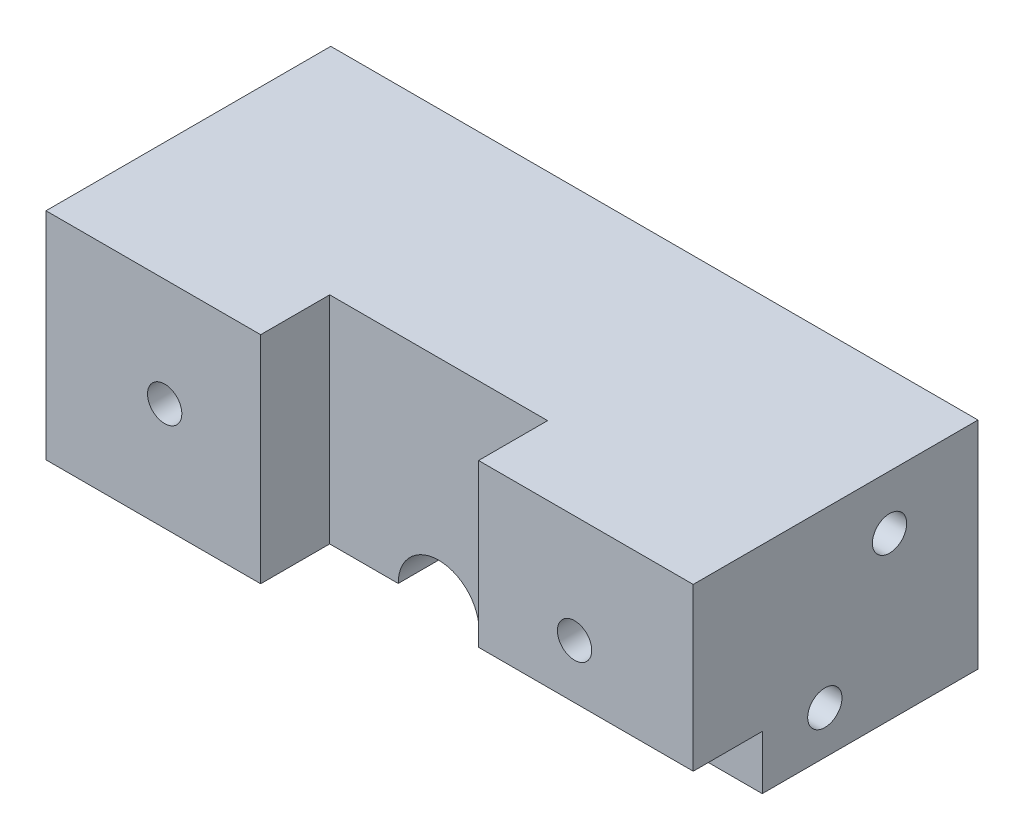
ISO-10303-21;
HEADER;
FILE_DESCRIPTION(('STEP AP214'),'2;1');
FILE_NAME('part.step','',(''),(''),'','','');
FILE_SCHEMA(('AUTOMOTIVE_DESIGN { 1 0 10303 214 1 1 1 1 }'));
ENDSEC;
DATA;
#1=APPLICATION_CONTEXT('core data for automotive mechanical design processes');
#2=APPLICATION_PROTOCOL_DEFINITION('international standard','automotive_design',2000,#1);
#3=PRODUCT_CONTEXT('',#1,'mechanical');
#4=PRODUCT('Part','Part','',(#3));
#5=PRODUCT_RELATED_PRODUCT_CATEGORY('part','',(#4));
#6=PRODUCT_DEFINITION_FORMATION('','',#4);
#7=PRODUCT_DEFINITION_CONTEXT('part definition',#1,'design');
#8=PRODUCT_DEFINITION('design','',#6,#7);
#9=PRODUCT_DEFINITION_SHAPE('','',#8);
#10=(LENGTH_UNIT() NAMED_UNIT(*) SI_UNIT(.MILLI.,.METRE.));
#11=(NAMED_UNIT(*) PLANE_ANGLE_UNIT() SI_UNIT($,.RADIAN.));
#12=(NAMED_UNIT(*) SI_UNIT($,.STERADIAN.) SOLID_ANGLE_UNIT());
#13=UNCERTAINTY_MEASURE_WITH_UNIT(LENGTH_MEASURE(1.E-05),#10,'distance_accuracy_value','');
#14=(GEOMETRIC_REPRESENTATION_CONTEXT(3) GLOBAL_UNCERTAINTY_ASSIGNED_CONTEXT((#13)) GLOBAL_UNIT_ASSIGNED_CONTEXT((#10,
#11,#12)) REPRESENTATION_CONTEXT('',''));
#15=CARTESIAN_POINT('',(0.,0.,0.));
#16=DIRECTION('',(0.,0.,1.));
#17=DIRECTION('',(1.,0.,0.));
#18=AXIS2_PLACEMENT_3D('',#15,#16,#17);
#19=CARTESIAN_POINT('',(0.,0.,-39.497));
#20=DIRECTION('',(0.,0.,-1.));
#21=DIRECTION('',(-1.,0.,0.));
#22=AXIS2_PLACEMENT_3D('',#19,#20,#21);
#23=PLANE('',#22);
#24=DIRECTION('',(0.,1.,0.));
#25=VECTOR('',#24,1.);
#26=CARTESIAN_POINT('',(38.1,-12.7,-39.497));
#27=LINE('',#26,#25);
#28=CARTESIAN_POINT('',(38.1,-6.35,-39.497));
#29=VERTEX_POINT('',#28);
#30=CARTESIAN_POINT('',(38.1,12.7,-39.497));
#31=VERTEX_POINT('',#30);
#32=EDGE_CURVE('E262',#29,#31,#27,.T.);
#33=ORIENTED_EDGE('',*,*,#32,.T.);
#34=DIRECTION('',(1.,0.,0.));
#35=VECTOR('',#34,1.);
#36=CARTESIAN_POINT('',(0.,12.7,-39.497));
#37=LINE('',#36,#35);
#38=CARTESIAN_POINT('',(12.827,12.7,-39.497));
#39=VERTEX_POINT('',#38);
#40=EDGE_CURVE('E261',#39,#31,#37,.T.);
#41=ORIENTED_EDGE('',*,*,#40,.F.);
#42=DIRECTION('',(0.,-1.,0.));
#43=VECTOR('',#42,1.);
#44=CARTESIAN_POINT('',(12.827,12.7,-39.497));
#45=LINE('',#44,#43);
#46=CARTESIAN_POINT('',(12.827,-6.35,-39.497));
#47=VERTEX_POINT('',#46);
#48=EDGE_CURVE('E11',#39,#47,#45,.T.);
#49=ORIENTED_EDGE('',*,*,#48,.T.);
#50=DIRECTION('',(-1.,0.,0.));
#51=VECTOR('',#50,1.);
#52=CARTESIAN_POINT('',(12.827,-6.35,-39.497));
#53=LINE('',#52,#51);
#54=EDGE_CURVE('E198',#29,#47,#53,.T.);
#55=ORIENTED_EDGE('',*,*,#54,.F.);
#56=EDGE_LOOP('',(#33,#41,#49,#55));
#57=FACE_BOUND('',#56,.T.);
#58=CARTESIAN_POINT('',(24.13,0.,-39.497));
#59=DIRECTION('',(0.,0.,-1.));
#60=DIRECTION('',(-1.,0.,0.));
#61=AXIS2_PLACEMENT_3D('',#58,#59,#60);
#62=CIRCLE('',#61,2.0193);
#63=CARTESIAN_POINT('',(22.1107,0.,-39.497));
#64=VERTEX_POINT('',#63);
#65=EDGE_CURVE('E267',#64,#64,#62,.F.);
#66=ORIENTED_EDGE('',*,*,#65,.F.);
#67=EDGE_LOOP('',(#66));
#68=FACE_BOUND('',#67,.T.);
#69=ADVANCED_FACE('F36',(#57,#68),#23,.F.);
#70=DIRECTION('',(1.,0.,0.));
#71=VECTOR('',#70,1.);
#72=CARTESIAN_POINT('',(0.,-12.7,-39.497));
#73=LINE('',#72,#71);
#74=CARTESIAN_POINT('',(-38.1,-12.7,-39.497));
#75=VERTEX_POINT('',#74);
#76=CARTESIAN_POINT('',(-12.827,-12.7,-39.497));
#77=VERTEX_POINT('',#76);
#78=EDGE_CURVE('E39',#75,#77,#73,.T.);
#79=ORIENTED_EDGE('',*,*,#78,.T.);
#80=DIRECTION('',(0.,-1.,0.));
#81=VECTOR('',#80,1.);
#82=CARTESIAN_POINT('',(-12.827,12.7,-39.497));
#83=LINE('',#82,#81);
#84=CARTESIAN_POINT('',(-12.827,12.7,-39.497));
#85=VERTEX_POINT('',#84);
#86=EDGE_CURVE('E221',#85,#77,#83,.T.);
#87=ORIENTED_EDGE('',*,*,#86,.F.);
#88=CARTESIAN_POINT('',(-38.1,12.7,-39.497));
#89=VERTEX_POINT('',#88);
#90=EDGE_CURVE('E259',#89,#85,#37,.T.);
#91=ORIENTED_EDGE('',*,*,#90,.F.);
#92=DIRECTION('',(0.,-1.,0.));
#93=VECTOR('',#92,1.);
#94=CARTESIAN_POINT('',(-38.1,-12.7,-39.497));
#95=LINE('',#94,#93);
#96=EDGE_CURVE('E44',#89,#75,#95,.T.);
#97=ORIENTED_EDGE('',*,*,#96,.T.);
#98=EDGE_LOOP('',(#79,#87,#91,#97));
#99=FACE_BOUND('',#98,.T.);
#100=CARTESIAN_POINT('',(-24.13,0.,-39.497));
#101=DIRECTION('',(0.,0.,-1.));
#102=DIRECTION('',(-1.,0.,0.));
#103=AXIS2_PLACEMENT_3D('',#100,#101,#102);
#104=CIRCLE('',#103,2.0193);
#105=CARTESIAN_POINT('',(-26.1493,0.,-39.497));
#106=VERTEX_POINT('',#105);
#107=EDGE_CURVE('E254',#106,#106,#104,.F.);
#108=ORIENTED_EDGE('',*,*,#107,.F.);
#109=EDGE_LOOP('',(#108));
#110=FACE_BOUND('',#109,.T.);
#111=ADVANCED_FACE('F272',(#99,#110),#23,.F.);
#112=CARTESIAN_POINT('',(12.7,0.,-57.15));
#113=DIRECTION('',(0.,-1.,0.));
#114=DIRECTION('',(0.,0.,-1.));
#115=AXIS2_PLACEMENT_3D('',#112,#113,#114);
#116=PLANE('',#115);
#117=CARTESIAN_POINT('',(12.7,0.,-57.15));
#118=DIRECTION('',(0.,-1.,0.));
#119=DIRECTION('',(0.,0.,-1.));
#120=AXIS2_PLACEMENT_3D('',#117,#118,#119);
#121=CIRCLE('',#120,2.0193);
#122=CARTESIAN_POINT('',(12.7,0.,-59.1693));
#123=VERTEX_POINT('',#122);
#124=EDGE_CURVE('E164',#123,#123,#121,.T.);
#125=ORIENTED_EDGE('',*,*,#124,.T.);
#126=EDGE_LOOP('',(#125));
#127=FACE_BOUND('',#126,.T.);
#128=ADVANCED_FACE('F134',(#127),#116,.T.);
#129=CARTESIAN_POINT('',(12.7,0.,-68.2625));
#130=DIRECTION('',(0.,-1.,0.));
#131=DIRECTION('',(0.,0.,-1.));
#132=AXIS2_PLACEMENT_3D('',#129,#130,#131);
#133=CONICAL_SURFACE('',#132,1.7272,1.02974425867665);
#134=CARTESIAN_POINT('',(12.7,1.0378064611844,-68.2625));
#135=VERTEX_POINT('',#134);
#136=VERTEX_LOOP('',#135);
#137=FACE_BOUND('',#136,.T.);
#138=CARTESIAN_POINT('',(12.7,0.,-68.2625));
#139=DIRECTION('',(0.,-1.,0.));
#140=DIRECTION('',(0.,0.,-1.));
#141=AXIS2_PLACEMENT_3D('',#138,#139,#140);
#142=CIRCLE('',#141,1.7272);
#143=CARTESIAN_POINT('',(12.7,0.,-69.9897));
#144=VERTEX_POINT('',#143);
#145=EDGE_CURVE('E138',#144,#144,#142,.T.);
#146=ORIENTED_EDGE('',*,*,#145,.T.);
#147=EDGE_LOOP('',(#146));
#148=FACE_BOUND('',#147,.T.);
#149=ADVANCED_FACE('F130',(#137,#148),#133,.F.);
#150=CARTESIAN_POINT('',(-31.75,0.,-57.15));
#151=DIRECTION('',(0.,-1.,0.));
#152=DIRECTION('',(0.,0.,-1.));
#153=AXIS2_PLACEMENT_3D('',#150,#151,#152);
#154=PLANE('',#153);
#155=CARTESIAN_POINT('',(-31.75,0.,-57.15));
#156=DIRECTION('',(0.,-1.,0.));
#157=DIRECTION('',(0.,0.,-1.));
#158=AXIS2_PLACEMENT_3D('',#155,#156,#157);
#159=CIRCLE('',#158,2.0193);
#160=CARTESIAN_POINT('',(-31.75,0.,-59.1693));
#161=VERTEX_POINT('',#160);
#162=EDGE_CURVE('E170',#161,#161,#159,.T.);
#163=ORIENTED_EDGE('',*,*,#162,.T.);
#164=EDGE_LOOP('',(#163));
#165=FACE_BOUND('',#164,.T.);
#166=ADVANCED_FACE('F133',(#165),#154,.T.);
#167=CARTESIAN_POINT('',(-12.7,0.,-68.2625));
#168=DIRECTION('',(0.,-1.,0.));
#169=DIRECTION('',(0.,0.,-1.));
#170=AXIS2_PLACEMENT_3D('',#167,#168,#169);
#171=CONICAL_SURFACE('',#170,1.7272,1.02974425867665);
#172=CARTESIAN_POINT('',(-12.7,1.0378064611844,-68.2625));
#173=VERTEX_POINT('',#172);
#174=VERTEX_LOOP('',#173);
#175=FACE_BOUND('',#174,.T.);
#176=CARTESIAN_POINT('',(-12.7,0.,-68.2625));
#177=DIRECTION('',(0.,-1.,0.));
#178=DIRECTION('',(0.,0.,-1.));
#179=AXIS2_PLACEMENT_3D('',#176,#177,#178);
#180=CIRCLE('',#179,1.7272);
#181=CARTESIAN_POINT('',(-12.7,0.,-69.9897));
#182=VERTEX_POINT('',#181);
#183=EDGE_CURVE('E144',#182,#182,#180,.T.);
#184=ORIENTED_EDGE('',*,*,#183,.T.);
#185=EDGE_LOOP('',(#184));
#186=FACE_BOUND('',#185,.T.);
#187=ADVANCED_FACE('F562',(#175,#186),#171,.F.);
#188=CARTESIAN_POINT('',(23.9776,-7.62,-54.991));
#189=DIRECTION('',(1.,0.,0.));
#190=DIRECTION('',(0.,0.,-1.));
#191=AXIS2_PLACEMENT_3D('',#188,#189,#190);
#192=CONICAL_SURFACE('',#191,2.01929999999999,1.02974425867665);
#193=CARTESIAN_POINT('',(22.7642821519977,-7.62000000000001,-54.991));
#194=VERTEX_POINT('',#193);
#195=VERTEX_LOOP('',#194);
#196=FACE_BOUND('',#195,.T.);
#197=CARTESIAN_POINT('',(23.9776,-7.62,-54.991));
#198=DIRECTION('',(1.,0.,0.));
#199=DIRECTION('',(0.,0.,-1.));
#200=AXIS2_PLACEMENT_3D('',#197,#198,#199);
#201=CIRCLE('',#200,2.01929999999999);
#202=CARTESIAN_POINT('',(23.9776,-7.62,-57.0103));
#203=VERTEX_POINT('',#202);
#204=EDGE_CURVE('E160',#203,#203,#201,.T.);
#205=ORIENTED_EDGE('',*,*,#204,.T.);
#206=EDGE_LOOP('',(#205));
#207=FACE_BOUND('',#206,.T.);
#208=ADVANCED_FACE('F553',(#196,#207),#192,.F.);
#209=CARTESIAN_POINT('',(23.9776,6.35,-62.611));
#210=DIRECTION('',(1.,0.,0.));
#211=DIRECTION('',(0.,0.,-1.));
#212=AXIS2_PLACEMENT_3D('',#209,#210,#211);
#213=CONICAL_SURFACE('',#212,2.01929999999999,1.02974425867665);
#214=CARTESIAN_POINT('',(22.7642821519977,6.34999999999999,-62.611));
#215=VERTEX_POINT('',#214);
#216=VERTEX_LOOP('',#215);
#217=FACE_BOUND('',#216,.T.);
#218=CARTESIAN_POINT('',(23.9776,6.35,-62.611));
#219=DIRECTION('',(1.,0.,0.));
#220=DIRECTION('',(0.,0.,-1.));
#221=AXIS2_PLACEMENT_3D('',#218,#219,#220);
#222=CIRCLE('',#221,2.01929999999999);
#223=CARTESIAN_POINT('',(23.9776,6.35,-64.6303));
#224=VERTEX_POINT('',#223);
#225=EDGE_CURVE('E154',#224,#224,#222,.T.);
#226=ORIENTED_EDGE('',*,*,#225,.T.);
#227=EDGE_LOOP('',(#226));
#228=FACE_BOUND('',#227,.T.);
#229=ADVANCED_FACE('F544',(#217,#228),#213,.F.);
#230=CARTESIAN_POINT('',(12.7,0.,-57.15));
#231=DIRECTION('',(0.,-1.,0.));
#232=DIRECTION('',(0.,0.,-1.));
#233=AXIS2_PLACEMENT_3D('',#230,#231,#232);
#234=CYLINDRICAL_SURFACE('',#233,2.0193);
#235=ORIENTED_EDGE('',*,*,#124,.F.);
#236=EDGE_LOOP('',(#235));
#237=FACE_BOUND('',#236,.T.);
#238=CARTESIAN_POINT('',(12.7,-12.7,-57.15));
#239=DIRECTION('',(0.,-1.,0.));
#240=DIRECTION('',(0.,0.,-1.));
#241=AXIS2_PLACEMENT_3D('',#238,#239,#240);
#242=CIRCLE('',#241,2.0193);
#243=CARTESIAN_POINT('',(12.7,-12.7,-59.1693));
#244=VERTEX_POINT('',#243);
#245=EDGE_CURVE('E163',#244,#244,#242,.T.);
#246=ORIENTED_EDGE('',*,*,#245,.T.);
#247=EDGE_LOOP('',(#246));
#248=FACE_BOUND('',#247,.T.);
#249=ADVANCED_FACE('F533',(#237,#248),#234,.F.);
#250=CARTESIAN_POINT('',(12.7,-12.7,-68.2625));
#251=DIRECTION('',(0.,-1.,0.));
#252=DIRECTION('',(0.,0.,-1.));
#253=AXIS2_PLACEMENT_3D('',#250,#251,#252);
#254=CYLINDRICAL_SURFACE('',#253,1.72719999999999);
#255=ORIENTED_EDGE('',*,*,#145,.F.);
#256=EDGE_LOOP('',(#255));
#257=FACE_BOUND('',#256,.T.);
#258=CARTESIAN_POINT('',(12.7,-12.7,-68.2625));
#259=DIRECTION('',(0.,-1.,0.));
#260=DIRECTION('',(0.,0.,-1.));
#261=AXIS2_PLACEMENT_3D('',#258,#259,#260);
#262=CIRCLE('',#261,1.72719999999999);
#263=CARTESIAN_POINT('',(12.7,-12.7,-69.9897));
#264=VERTEX_POINT('',#263);
#265=EDGE_CURVE('E141',#264,#264,#262,.T.);
#266=ORIENTED_EDGE('',*,*,#265,.T.);
#267=EDGE_LOOP('',(#266));
#268=FACE_BOUND('',#267,.T.);
#269=ADVANCED_FACE('F337',(#257,#268),#254,.F.);
#270=CARTESIAN_POINT('',(24.13,0.,-67.564));
#271=DIRECTION('',(0.,0.,-1.));
#272=DIRECTION('',(-1.,0.,0.));
#273=AXIS2_PLACEMENT_3D('',#270,#271,#272);
#274=CYLINDRICAL_SURFACE('',#273,4.2164);
#275=CARTESIAN_POINT('',(24.13,0.,-67.564));
#276=DIRECTION('',(0.,0.,-1.));
#277=DIRECTION('',(-1.,0.,0.));
#278=AXIS2_PLACEMENT_3D('',#275,#276,#277);
#279=CIRCLE('',#278,4.2164);
#280=CARTESIAN_POINT('',(19.9136,0.,-67.564));
#281=VERTEX_POINT('',#280);
#282=EDGE_CURVE('E182',#281,#281,#279,.T.);
#283=ORIENTED_EDGE('',*,*,#282,.F.);
#284=EDGE_LOOP('',(#283));
#285=FACE_BOUND('',#284,.T.);
#286=CARTESIAN_POINT('',(24.13,0.,-73.025));
#287=DIRECTION('',(0.,0.,-1.));
#288=DIRECTION('',(-1.,0.,0.));
#289=AXIS2_PLACEMENT_3D('',#286,#287,#288);
#290=CIRCLE('',#289,4.2164);
#291=CARTESIAN_POINT('',(19.9136,0.,-73.025));
#292=VERTEX_POINT('',#291);
#293=EDGE_CURVE('E186',#292,#292,#290,.T.);
#294=ORIENTED_EDGE('',*,*,#293,.T.);
#295=EDGE_LOOP('',(#294));
#296=FACE_BOUND('',#295,.T.);
#297=ADVANCED_FACE('F331',(#285,#296),#274,.F.);
#298=CARTESIAN_POINT('',(24.13,0.,-67.564));
#299=DIRECTION('',(0.,0.,-1.));
#300=DIRECTION('',(-1.,0.,0.));
#301=AXIS2_PLACEMENT_3D('',#298,#299,#300);
#302=PLANE('',#301);
#303=ORIENTED_EDGE('',*,*,#282,.T.);
#304=EDGE_LOOP('',(#303));
#305=FACE_BOUND('',#304,.T.);
#306=CARTESIAN_POINT('',(24.13,0.,-67.564));
#307=DIRECTION('',(0.,0.,-1.));
#308=DIRECTION('',(-1.,0.,0.));
#309=AXIS2_PLACEMENT_3D('',#306,#307,#308);
#310=CIRCLE('',#309,2.0193);
#311=CARTESIAN_POINT('',(22.1107,0.,-67.564));
#312=VERTEX_POINT('',#311);
#313=EDGE_CURVE('E185',#312,#312,#310,.F.);
#314=ORIENTED_EDGE('',*,*,#313,.T.);
#315=EDGE_LOOP('',(#314));
#316=FACE_BOUND('',#315,.T.);
#317=ADVANCED_FACE('F326',(#305,#316),#302,.T.);
#318=CARTESIAN_POINT('',(24.13,0.,-15.875));
#319=DIRECTION('',(0.,0.,-1.));
#320=DIRECTION('',(-1.,0.,0.));
#321=AXIS2_PLACEMENT_3D('',#318,#319,#320);
#322=CYLINDRICAL_SURFACE('',#321,2.0193);
#323=ORIENTED_EDGE('',*,*,#65,.T.);
#324=EDGE_LOOP('',(#323));
#325=FACE_BOUND('',#324,.T.);
#326=ORIENTED_EDGE('',*,*,#313,.F.);
#327=EDGE_LOOP('',(#326));
#328=FACE_BOUND('',#327,.T.);
#329=ADVANCED_FACE('F322',(#325,#328),#322,.F.);
#330=CARTESIAN_POINT('',(-24.13,0.,-67.564));
#331=DIRECTION('',(0.,0.,-1.));
#332=DIRECTION('',(-1.,0.,0.));
#333=AXIS2_PLACEMENT_3D('',#330,#331,#332);
#334=CYLINDRICAL_SURFACE('',#333,4.2164);
#335=CARTESIAN_POINT('',(-24.13,0.,-67.564));
#336=DIRECTION('',(0.,0.,-1.));
#337=DIRECTION('',(-1.,0.,0.));
#338=AXIS2_PLACEMENT_3D('',#335,#336,#337);
#339=CIRCLE('',#338,4.2164);
#340=CARTESIAN_POINT('',(-28.3464,0.,-67.564));
#341=VERTEX_POINT('',#340);
#342=EDGE_CURVE('E176',#341,#341,#339,.T.);
#343=ORIENTED_EDGE('',*,*,#342,.F.);
#344=EDGE_LOOP('',(#343));
#345=FACE_BOUND('',#344,.T.);
#346=CARTESIAN_POINT('',(-24.13,0.,-73.025));
#347=DIRECTION('',(0.,0.,-1.));
#348=DIRECTION('',(-1.,0.,0.));
#349=AXIS2_PLACEMENT_3D('',#346,#347,#348);
#350=CIRCLE('',#349,4.2164);
#351=CARTESIAN_POINT('',(-28.3464,0.,-73.025));
#352=VERTEX_POINT('',#351);
#353=EDGE_CURVE('E173',#352,#352,#350,.T.);
#354=ORIENTED_EDGE('',*,*,#353,.T.);
#355=EDGE_LOOP('',(#354));
#356=FACE_BOUND('',#355,.T.);
#357=ADVANCED_FACE('F325',(#345,#356),#334,.F.);
#358=CARTESIAN_POINT('',(-24.13,0.,-67.564));
#359=DIRECTION('',(0.,0.,-1.));
#360=DIRECTION('',(-1.,0.,0.));
#361=AXIS2_PLACEMENT_3D('',#358,#359,#360);
#362=PLANE('',#361);
#363=ORIENTED_EDGE('',*,*,#342,.T.);
#364=EDGE_LOOP('',(#363));
#365=FACE_BOUND('',#364,.T.);
#366=CARTESIAN_POINT('',(-24.13,0.,-67.564));
#367=DIRECTION('',(0.,0.,-1.));
#368=DIRECTION('',(-1.,0.,0.));
#369=AXIS2_PLACEMENT_3D('',#366,#367,#368);
#370=CIRCLE('',#369,2.0193);
#371=CARTESIAN_POINT('',(-26.1493,0.,-67.564));
#372=VERTEX_POINT('',#371);
#373=EDGE_CURVE('E179',#372,#372,#370,.F.);
#374=ORIENTED_EDGE('',*,*,#373,.T.);
#375=EDGE_LOOP('',(#374));
#376=FACE_BOUND('',#375,.T.);
#377=ADVANCED_FACE('F346',(#365,#376),#362,.T.);
#378=CARTESIAN_POINT('',(-24.13,0.,-15.875));
#379=DIRECTION('',(0.,0.,-1.));
#380=DIRECTION('',(-1.,0.,0.));
#381=AXIS2_PLACEMENT_3D('',#378,#379,#380);
#382=CYLINDRICAL_SURFACE('',#381,2.0193);
#383=ORIENTED_EDGE('',*,*,#107,.T.);
#384=EDGE_LOOP('',(#383));
#385=FACE_BOUND('',#384,.T.);
#386=ORIENTED_EDGE('',*,*,#373,.F.);
#387=EDGE_LOOP('',(#386));
#388=FACE_BOUND('',#387,.T.);
#389=ADVANCED_FACE('F343',(#385,#388),#382,.F.);
#390=CARTESIAN_POINT('',(-31.75,0.,-57.15));
#391=DIRECTION('',(0.,-1.,0.));
#392=DIRECTION('',(0.,0.,-1.));
#393=AXIS2_PLACEMENT_3D('',#390,#391,#392);
#394=CYLINDRICAL_SURFACE('',#393,2.0193);
#395=ORIENTED_EDGE('',*,*,#162,.F.);
#396=EDGE_LOOP('',(#395));
#397=FACE_BOUND('',#396,.T.);
#398=CARTESIAN_POINT('',(-31.75,-12.7,-57.15));
#399=DIRECTION('',(0.,-1.,0.));
#400=DIRECTION('',(0.,0.,-1.));
#401=AXIS2_PLACEMENT_3D('',#398,#399,#400);
#402=CIRCLE('',#401,2.0193);
#403=CARTESIAN_POINT('',(-31.75,-12.7,-59.1693));
#404=VERTEX_POINT('',#403);
#405=EDGE_CURVE('E167',#404,#404,#402,.T.);
#406=ORIENTED_EDGE('',*,*,#405,.T.);
#407=EDGE_LOOP('',(#406));
#408=FACE_BOUND('',#407,.T.);
#409=ADVANCED_FACE('F345',(#397,#408),#394,.F.);
#410=CARTESIAN_POINT('',(-12.7,-12.7,-68.2625));
#411=DIRECTION('',(0.,-1.,0.));
#412=DIRECTION('',(0.,0.,-1.));
#413=AXIS2_PLACEMENT_3D('',#410,#411,#412);
#414=CYLINDRICAL_SURFACE('',#413,1.72719999999999);
#415=ORIENTED_EDGE('',*,*,#183,.F.);
#416=EDGE_LOOP('',(#415));
#417=FACE_BOUND('',#416,.T.);
#418=CARTESIAN_POINT('',(-12.7,-12.7,-68.2625));
#419=DIRECTION('',(0.,-1.,0.));
#420=DIRECTION('',(0.,0.,-1.));
#421=AXIS2_PLACEMENT_3D('',#418,#419,#420);
#422=CIRCLE('',#421,1.72719999999999);
#423=CARTESIAN_POINT('',(-12.7,-12.7,-69.9897));
#424=VERTEX_POINT('',#423);
#425=EDGE_CURVE('E140',#424,#424,#422,.T.);
#426=ORIENTED_EDGE('',*,*,#425,.T.);
#427=EDGE_LOOP('',(#426));
#428=FACE_BOUND('',#427,.T.);
#429=ADVANCED_FACE('F360',(#417,#428),#414,.F.);
#430=CARTESIAN_POINT('',(0.,-12.7,-47.625));
#431=DIRECTION('',(0.,0.,-1.));
#432=DIRECTION('',(-1.,0.,0.));
#433=AXIS2_PLACEMENT_3D('',#430,#431,#432);
#434=CYLINDRICAL_SURFACE('',#433,4.7625);
#435=DIRECTION('',(0.,0.,-1.));
#436=VECTOR('',#435,1.);
#437=CARTESIAN_POINT('',(-4.7625,-12.7,-47.625));
#438=LINE('',#437,#436);
#439=CARTESIAN_POINT('',(-4.7625,-12.7,-47.625));
#440=VERTEX_POINT('',#439);
#441=CARTESIAN_POINT('',(-4.7625,-12.7,-73.025));
#442=VERTEX_POINT('',#441);
#443=EDGE_CURVE('E252',#440,#442,#438,.T.);
#444=ORIENTED_EDGE('',*,*,#443,.T.);
#445=CARTESIAN_POINT('',(0.,-12.7,-73.025));
#446=DIRECTION('',(0.,0.,-1.));
#447=DIRECTION('',(-1.,0.,0.));
#448=AXIS2_PLACEMENT_3D('',#445,#446,#447);
#449=CIRCLE('',#448,4.7625);
#450=CARTESIAN_POINT('',(4.7625,-12.7,-73.025));
#451=VERTEX_POINT('',#450);
#452=EDGE_CURVE('E224',#442,#451,#449,.T.);
#453=ORIENTED_EDGE('',*,*,#452,.T.);
#454=DIRECTION('',(0.,0.,-1.));
#455=VECTOR('',#454,1.);
#456=CARTESIAN_POINT('',(4.7625,-12.7,-47.625));
#457=LINE('',#456,#455);
#458=CARTESIAN_POINT('',(4.7625,-12.7,-47.625));
#459=VERTEX_POINT('',#458);
#460=EDGE_CURVE('E247',#451,#459,#457,.F.);
#461=ORIENTED_EDGE('',*,*,#460,.T.);
#462=CARTESIAN_POINT('',(0.,-12.7,-47.625));
#463=DIRECTION('',(0.,0.,-1.));
#464=DIRECTION('',(-1.,0.,0.));
#465=AXIS2_PLACEMENT_3D('',#462,#463,#464);
#466=CIRCLE('',#465,4.7625);
#467=EDGE_CURVE('E225',#440,#459,#466,.T.);
#468=ORIENTED_EDGE('',*,*,#467,.F.);
#469=EDGE_LOOP('',(#444,#453,#461,#468));
#470=FACE_BOUND('',#469,.T.);
#471=ADVANCED_FACE('F304',(#470),#434,.F.);
#472=CARTESIAN_POINT('',(38.1,-7.62,-54.991));
#473=DIRECTION('',(1.,0.,0.));
#474=DIRECTION('',(0.,0.,-1.));
#475=AXIS2_PLACEMENT_3D('',#472,#473,#474);
#476=CYLINDRICAL_SURFACE('',#475,2.01929999999999);
#477=ORIENTED_EDGE('',*,*,#204,.F.);
#478=EDGE_LOOP('',(#477));
#479=FACE_BOUND('',#478,.T.);
#480=CARTESIAN_POINT('',(38.1,-7.62,-54.991));
#481=DIRECTION('',(1.,0.,0.));
#482=DIRECTION('',(0.,0.,-1.));
#483=AXIS2_PLACEMENT_3D('',#480,#481,#482);
#484=CIRCLE('',#483,2.01929999999999);
#485=CARTESIAN_POINT('',(38.1,-7.62,-57.0103));
#486=VERTEX_POINT('',#485);
#487=EDGE_CURVE('E157',#486,#486,#484,.T.);
#488=ORIENTED_EDGE('',*,*,#487,.T.);
#489=EDGE_LOOP('',(#488));
#490=FACE_BOUND('',#489,.T.);
#491=ADVANCED_FACE('F359',(#479,#490),#476,.F.);
#492=CARTESIAN_POINT('',(38.1,6.35,-62.611));
#493=DIRECTION('',(1.,0.,0.));
#494=DIRECTION('',(0.,0.,-1.));
#495=AXIS2_PLACEMENT_3D('',#492,#493,#494);
#496=CYLINDRICAL_SURFACE('',#495,2.01929999999999);
#497=ORIENTED_EDGE('',*,*,#225,.F.);
#498=EDGE_LOOP('',(#497));
#499=FACE_BOUND('',#498,.T.);
#500=CARTESIAN_POINT('',(38.1,6.35,-62.611));
#501=DIRECTION('',(1.,0.,0.));
#502=DIRECTION('',(0.,0.,-1.));
#503=AXIS2_PLACEMENT_3D('',#500,#501,#502);
#504=CIRCLE('',#503,2.01929999999999);
#505=CARTESIAN_POINT('',(38.1,6.35,-64.6303));
#506=VERTEX_POINT('',#505);
#507=EDGE_CURVE('E151',#506,#506,#504,.T.);
#508=ORIENTED_EDGE('',*,*,#507,.T.);
#509=EDGE_LOOP('',(#508));
#510=FACE_BOUND('',#509,.T.);
#511=ADVANCED_FACE('F365',(#499,#510),#496,.F.);
#512=CARTESIAN_POINT('',(0.,-12.7,0.));
#513=DIRECTION('',(0.,-1.,0.));
#514=DIRECTION('',(0.,0.,-1.));
#515=AXIS2_PLACEMENT_3D('',#512,#513,#514);
#516=PLANE('',#515);
#517=ORIENTED_EDGE('',*,*,#265,.F.);
#518=EDGE_LOOP('',(#517));
#519=FACE_BOUND('',#518,.T.);
#520=ORIENTED_EDGE('',*,*,#245,.F.);
#521=EDGE_LOOP('',(#520));
#522=FACE_BOUND('',#521,.T.);
#523=DIRECTION('',(0.,0.,-1.));
#524=VECTOR('',#523,1.);
#525=CARTESIAN_POINT('',(38.1,-12.7,73.025));
#526=LINE('',#525,#524);
#527=CARTESIAN_POINT('',(38.1,-12.7,-47.625));
#528=VERTEX_POINT('',#527);
#529=CARTESIAN_POINT('',(38.1,-12.7,-73.025));
#530=VERTEX_POINT('',#529);
#531=EDGE_CURVE('E236',#528,#530,#526,.T.);
#532=ORIENTED_EDGE('',*,*,#531,.F.);
#533=DIRECTION('',(-1.,0.,0.));
#534=VECTOR('',#533,1.);
#535=CARTESIAN_POINT('',(12.827,-12.7,-47.625));
#536=LINE('',#535,#534);
#537=EDGE_CURVE('E207',#528,#459,#536,.T.);
#538=ORIENTED_EDGE('',*,*,#537,.T.);
#539=ORIENTED_EDGE('',*,*,#460,.F.);
#540=DIRECTION('',(-1.,0.,0.));
#541=VECTOR('',#540,1.);
#542=CARTESIAN_POINT('',(-38.1,-12.7,-73.025));
#543=LINE('',#542,#541);
#544=EDGE_CURVE('E239',#530,#451,#543,.T.);
#545=ORIENTED_EDGE('',*,*,#544,.F.);
#546=EDGE_LOOP('',(#532,#538,#539,#545));
#547=FACE_BOUND('',#546,.T.);
#548=ADVANCED_FACE('F301',(#519,#522,#547),#516,.T.);
#549=CARTESIAN_POINT('',(-38.1,-12.7,-73.025));
#550=DIRECTION('',(0.,0.,-1.));
#551=DIRECTION('',(-1.,0.,0.));
#552=AXIS2_PLACEMENT_3D('',#549,#550,#551);
#553=PLANE('',#552);
#554=ORIENTED_EDGE('',*,*,#353,.F.);
#555=EDGE_LOOP('',(#554));
#556=FACE_BOUND('',#555,.T.);
#557=ORIENTED_EDGE('',*,*,#293,.F.);
#558=EDGE_LOOP('',(#557));
#559=FACE_BOUND('',#558,.T.);
#560=ORIENTED_EDGE('',*,*,#452,.F.);
#561=CARTESIAN_POINT('',(-38.1,-12.7,-73.025));
#562=VERTEX_POINT('',#561);
#563=EDGE_CURVE('E238',#442,#562,#543,.T.);
#564=ORIENTED_EDGE('',*,*,#563,.T.);
#565=DIRECTION('',(0.,1.,0.));
#566=VECTOR('',#565,1.);
#567=CARTESIAN_POINT('',(-38.1,-12.7,-73.025));
#568=LINE('',#567,#566);
#569=CARTESIAN_POINT('',(-38.1,12.7,-73.025));
#570=VERTEX_POINT('',#569);
#571=EDGE_CURVE('E245',#562,#570,#568,.T.);
#572=ORIENTED_EDGE('',*,*,#571,.T.);
#573=DIRECTION('',(-1.,0.,0.));
#574=VECTOR('',#573,1.);
#575=CARTESIAN_POINT('',(-38.1,12.7,-73.025));
#576=LINE('',#575,#574);
#577=CARTESIAN_POINT('',(38.1,12.7,-73.025));
#578=VERTEX_POINT('',#577);
#579=EDGE_CURVE('E230',#578,#570,#576,.T.);
#580=ORIENTED_EDGE('',*,*,#579,.F.);
#581=DIRECTION('',(0.,1.,0.));
#582=VECTOR('',#581,1.);
#583=CARTESIAN_POINT('',(38.1,-12.7,-73.025));
#584=LINE('',#583,#582);
#585=EDGE_CURVE('E244',#530,#578,#584,.T.);
#586=ORIENTED_EDGE('',*,*,#585,.F.);
#587=ORIENTED_EDGE('',*,*,#544,.T.);
#588=EDGE_LOOP('',(#560,#564,#572,#580,#586,#587));
#589=FACE_BOUND('',#588,.T.);
#590=ADVANCED_FACE('F287',(#556,#559,#589),#553,.T.);
#591=ORIENTED_EDGE('',*,*,#78,.F.);
#592=DIRECTION('',(0.,0.,1.));
#593=VECTOR('',#592,1.);
#594=CARTESIAN_POINT('',(-38.1,-12.7,73.025));
#595=LINE('',#594,#593);
#596=EDGE_CURVE('E242',#562,#75,#595,.T.);
#597=ORIENTED_EDGE('',*,*,#596,.F.);
#598=ORIENTED_EDGE('',*,*,#563,.F.);
#599=ORIENTED_EDGE('',*,*,#443,.F.);
#600=CARTESIAN_POINT('',(-12.827,-12.7,-47.625));
#601=VERTEX_POINT('',#600);
#602=EDGE_CURVE('E206',#440,#601,#536,.T.);
#603=ORIENTED_EDGE('',*,*,#602,.T.);
#604=DIRECTION('',(0.,0.,1.));
#605=VECTOR('',#604,1.);
#606=CARTESIAN_POINT('',(-12.827,-12.7,-39.497));
#607=LINE('',#606,#605);
#608=EDGE_CURVE('E203',#601,#77,#607,.T.);
#609=ORIENTED_EDGE('',*,*,#608,.T.);
#610=EDGE_LOOP('',(#591,#597,#598,#599,#603,#609));
#611=FACE_BOUND('',#610,.T.);
#612=ORIENTED_EDGE('',*,*,#425,.F.);
#613=EDGE_LOOP('',(#612));
#614=FACE_BOUND('',#613,.T.);
#615=ORIENTED_EDGE('',*,*,#405,.F.);
#616=EDGE_LOOP('',(#615));
#617=FACE_BOUND('',#616,.T.);
#618=ADVANCED_FACE('F277',(#611,#614,#617),#516,.T.);
#619=CARTESIAN_POINT('',(0.,12.7,0.));
#620=DIRECTION('',(0.,-1.,0.));
#621=DIRECTION('',(0.,0.,-1.));
#622=AXIS2_PLACEMENT_3D('',#619,#620,#621);
#623=PLANE('',#622);
#624=DIRECTION('',(0.,0.,1.));
#625=VECTOR('',#624,1.);
#626=CARTESIAN_POINT('',(-38.1,12.7,73.025));
#627=LINE('',#626,#625);
#628=EDGE_CURVE('E233',#570,#89,#627,.T.);
#629=ORIENTED_EDGE('',*,*,#628,.T.);
#630=ORIENTED_EDGE('',*,*,#90,.T.);
#631=DIRECTION('',(0.,0.,1.));
#632=VECTOR('',#631,1.);
#633=CARTESIAN_POINT('',(-12.827,12.7,-39.497));
#634=LINE('',#633,#632);
#635=CARTESIAN_POINT('',(-12.827,12.7,-47.625));
#636=VERTEX_POINT('',#635);
#637=EDGE_CURVE('E210',#636,#85,#634,.T.);
#638=ORIENTED_EDGE('',*,*,#637,.F.);
#639=DIRECTION('',(-1.,0.,0.));
#640=VECTOR('',#639,1.);
#641=CARTESIAN_POINT('',(12.827,12.7,-47.625));
#642=LINE('',#641,#640);
#643=CARTESIAN_POINT('',(12.827,12.7,-47.625));
#644=VERTEX_POINT('',#643);
#645=EDGE_CURVE('E215',#644,#636,#642,.T.);
#646=ORIENTED_EDGE('',*,*,#645,.F.);
#647=DIRECTION('',(0.,0.,-1.));
#648=VECTOR('',#647,1.);
#649=CARTESIAN_POINT('',(12.827,12.7,-39.497));
#650=LINE('',#649,#648);
#651=EDGE_CURVE('E213',#39,#644,#650,.T.);
#652=ORIENTED_EDGE('',*,*,#651,.F.);
#653=ORIENTED_EDGE('',*,*,#40,.T.);
#654=DIRECTION('',(0.,0.,-1.));
#655=VECTOR('',#654,1.);
#656=CARTESIAN_POINT('',(38.1,12.7,73.025));
#657=LINE('',#656,#655);
#658=EDGE_CURVE('E227',#31,#578,#657,.T.);
#659=ORIENTED_EDGE('',*,*,#658,.T.);
#660=ORIENTED_EDGE('',*,*,#579,.T.);
#661=EDGE_LOOP('',(#629,#630,#638,#646,#652,#653,#659,#660));
#662=FACE_BOUND('',#661,.T.);
#663=ADVANCED_FACE('F290',(#662),#623,.F.);
#664=CARTESIAN_POINT('',(38.1,-12.7,73.025));
#665=DIRECTION('',(1.,0.,0.));
#666=DIRECTION('',(0.,0.,-1.));
#667=AXIS2_PLACEMENT_3D('',#664,#665,#666);
#668=PLANE('',#667);
#669=ORIENTED_EDGE('',*,*,#32,.F.);
#670=DIRECTION('',(0.,0.,1.));
#671=VECTOR('',#670,1.);
#672=CARTESIAN_POINT('',(38.1,-6.35,-39.497));
#673=LINE('',#672,#671);
#674=CARTESIAN_POINT('',(38.1,-6.35,-47.625));
#675=VERTEX_POINT('',#674);
#676=EDGE_CURVE('E195',#675,#29,#673,.T.);
#677=ORIENTED_EDGE('',*,*,#676,.F.);
#678=DIRECTION('',(0.,-1.,0.));
#679=VECTOR('',#678,1.);
#680=CARTESIAN_POINT('',(38.1,-6.35,-47.625));
#681=LINE('',#680,#679);
#682=EDGE_CURVE('E200',#675,#528,#681,.T.);
#683=ORIENTED_EDGE('',*,*,#682,.T.);
#684=ORIENTED_EDGE('',*,*,#531,.T.);
#685=ORIENTED_EDGE('',*,*,#585,.T.);
#686=ORIENTED_EDGE('',*,*,#658,.F.);
#687=EDGE_LOOP('',(#669,#677,#683,#684,#685,#686));
#688=FACE_BOUND('',#687,.T.);
#689=ORIENTED_EDGE('',*,*,#507,.F.);
#690=EDGE_LOOP('',(#689));
#691=FACE_BOUND('',#690,.T.);
#692=ORIENTED_EDGE('',*,*,#487,.F.);
#693=EDGE_LOOP('',(#692));
#694=FACE_BOUND('',#693,.T.);
#695=ADVANCED_FACE('F295',(#688,#691,#694),#668,.T.);
#696=CARTESIAN_POINT('',(12.827,12.7,-47.625));
#697=DIRECTION('',(0.,0.,1.));
#698=DIRECTION('',(1.,0.,0.));
#699=AXIS2_PLACEMENT_3D('',#696,#697,#698);
#700=PLANE('',#699);
#701=ORIENTED_EDGE('',*,*,#467,.T.);
#702=ORIENTED_EDGE('',*,*,#537,.F.);
#703=ORIENTED_EDGE('',*,*,#682,.F.);
#704=DIRECTION('',(1.,0.,0.));
#705=VECTOR('',#704,1.);
#706=CARTESIAN_POINT('',(12.827,-6.35,-47.625));
#707=LINE('',#706,#705);
#708=CARTESIAN_POINT('',(12.827,-6.35,-47.625));
#709=VERTEX_POINT('',#708);
#710=EDGE_CURVE('E192',#709,#675,#707,.T.);
#711=ORIENTED_EDGE('',*,*,#710,.F.);
#712=DIRECTION('',(0.,-1.,0.));
#713=VECTOR('',#712,1.);
#714=CARTESIAN_POINT('',(12.827,12.7,-47.625));
#715=LINE('',#714,#713);
#716=EDGE_CURVE('E219',#644,#709,#715,.T.);
#717=ORIENTED_EDGE('',*,*,#716,.F.);
#718=ORIENTED_EDGE('',*,*,#645,.T.);
#719=DIRECTION('',(0.,-1.,0.));
#720=VECTOR('',#719,1.);
#721=CARTESIAN_POINT('',(-12.827,12.7,-47.625));
#722=LINE('',#721,#720);
#723=EDGE_CURVE('E217',#636,#601,#722,.T.);
#724=ORIENTED_EDGE('',*,*,#723,.T.);
#725=ORIENTED_EDGE('',*,*,#602,.F.);
#726=EDGE_LOOP('',(#701,#702,#703,#711,#717,#718,#724,#725));
#727=FACE_BOUND('',#726,.T.);
#728=ADVANCED_FACE('F307',(#727),#700,.T.);
#729=CARTESIAN_POINT('',(12.827,12.7,-39.497));
#730=DIRECTION('',(-1.,0.,0.));
#731=DIRECTION('',(0.,0.,1.));
#732=AXIS2_PLACEMENT_3D('',#729,#730,#731);
#733=PLANE('',#732);
#734=ORIENTED_EDGE('',*,*,#716,.T.);
#735=DIRECTION('',(0.,0.,-1.));
#736=VECTOR('',#735,1.);
#737=CARTESIAN_POINT('',(12.827,-6.35,-39.497));
#738=LINE('',#737,#736);
#739=EDGE_CURVE('E189',#47,#709,#738,.T.);
#740=ORIENTED_EDGE('',*,*,#739,.F.);
#741=ORIENTED_EDGE('',*,*,#48,.F.);
#742=ORIENTED_EDGE('',*,*,#651,.T.);
#743=EDGE_LOOP('',(#734,#740,#741,#742));
#744=FACE_BOUND('',#743,.T.);
#745=ADVANCED_FACE('F313',(#744),#733,.T.);
#746=CARTESIAN_POINT('',(0.,-6.35,0.));
#747=DIRECTION('',(0.,-1.,0.));
#748=DIRECTION('',(0.,0.,-1.));
#749=AXIS2_PLACEMENT_3D('',#746,#747,#748);
#750=PLANE('',#749);
#751=ORIENTED_EDGE('',*,*,#739,.T.);
#752=ORIENTED_EDGE('',*,*,#710,.T.);
#753=ORIENTED_EDGE('',*,*,#676,.T.);
#754=ORIENTED_EDGE('',*,*,#54,.T.);
#755=EDGE_LOOP('',(#751,#752,#753,#754));
#756=FACE_BOUND('',#755,.T.);
#757=ADVANCED_FACE('F316',(#756),#750,.T.);
#758=CARTESIAN_POINT('',(-12.827,12.7,-39.497));
#759=DIRECTION('',(1.,0.,0.));
#760=DIRECTION('',(0.,0.,-1.));
#761=AXIS2_PLACEMENT_3D('',#758,#759,#760);
#762=PLANE('',#761);
#763=ORIENTED_EDGE('',*,*,#723,.F.);
#764=ORIENTED_EDGE('',*,*,#637,.T.);
#765=ORIENTED_EDGE('',*,*,#86,.T.);
#766=ORIENTED_EDGE('',*,*,#608,.F.);
#767=EDGE_LOOP('',(#763,#764,#765,#766));
#768=FACE_BOUND('',#767,.T.);
#769=ADVANCED_FACE('F312',(#768),#762,.T.);
#770=CARTESIAN_POINT('',(-38.1,-12.7,73.025));
#771=DIRECTION('',(-1.,0.,0.));
#772=DIRECTION('',(0.,0.,1.));
#773=AXIS2_PLACEMENT_3D('',#770,#771,#772);
#774=PLANE('',#773);
#775=ORIENTED_EDGE('',*,*,#96,.F.);
#776=ORIENTED_EDGE('',*,*,#628,.F.);
#777=ORIENTED_EDGE('',*,*,#571,.F.);
#778=ORIENTED_EDGE('',*,*,#596,.T.);
#779=EDGE_LOOP('',(#775,#776,#777,#778));
#780=FACE_BOUND('',#779,.T.);
#781=ADVANCED_FACE('F283',(#780),#774,.T.);
#782=CLOSED_SHELL('',(#69,#111,#128,#149,#166,#187,#208,#229,#249,#269,#297,#317,#329,#357,#377,
#389,#409,#429,#471,#491,#511,#548,#590,#618,#663,#695,#728,#745,#757,#769,#781));
#783=MANIFOLD_SOLID_BREP('B2',#782);
#784=ADVANCED_BREP_SHAPE_REPRESENTATION('',(#18,#783),#14);
#785=SHAPE_DEFINITION_REPRESENTATION(#9,#784);
ENDSEC;
END-ISO-10303-21;
